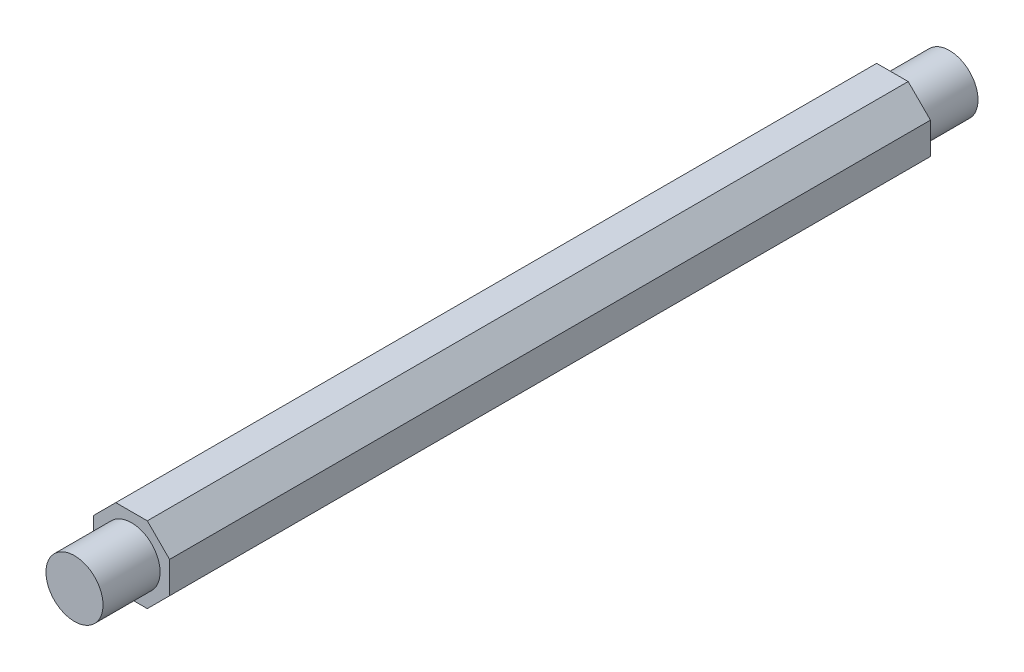
ISO-10303-21;
HEADER;
FILE_DESCRIPTION(('STEP AP214'),'2;1');
FILE_NAME('part.step','',(''),(''),'','','');
FILE_SCHEMA(('AUTOMOTIVE_DESIGN { 1 0 10303 214 1 1 1 1 }'));
ENDSEC;
DATA;
#1=APPLICATION_CONTEXT('core data for automotive mechanical design processes');
#2=APPLICATION_PROTOCOL_DEFINITION('international standard','automotive_design',2000,#1);
#3=PRODUCT_CONTEXT('',#1,'mechanical');
#4=PRODUCT('Part','Part','',(#3));
#5=PRODUCT_RELATED_PRODUCT_CATEGORY('part','',(#4));
#6=PRODUCT_DEFINITION_FORMATION('','',#4);
#7=PRODUCT_DEFINITION_CONTEXT('part definition',#1,'design');
#8=PRODUCT_DEFINITION('design','',#6,#7);
#9=PRODUCT_DEFINITION_SHAPE('','',#8);
#10=(LENGTH_UNIT() NAMED_UNIT(*) SI_UNIT(.MILLI.,.METRE.));
#11=(NAMED_UNIT(*) PLANE_ANGLE_UNIT() SI_UNIT($,.RADIAN.));
#12=(NAMED_UNIT(*) SI_UNIT($,.STERADIAN.) SOLID_ANGLE_UNIT());
#13=UNCERTAINTY_MEASURE_WITH_UNIT(LENGTH_MEASURE(1.E-05),#10,'distance_accuracy_value','');
#14=(GEOMETRIC_REPRESENTATION_CONTEXT(3) GLOBAL_UNCERTAINTY_ASSIGNED_CONTEXT((#13)) GLOBAL_UNIT_ASSIGNED_CONTEXT((#10,
#11,#12)) REPRESENTATION_CONTEXT('',''));
#15=CARTESIAN_POINT('',(0.,0.,0.));
#16=DIRECTION('',(0.,0.,1.));
#17=DIRECTION('',(1.,0.,0.));
#18=AXIS2_PLACEMENT_3D('',#15,#16,#17);
#19=CARTESIAN_POINT('',(-2.,-0.828427124746184,3.));
#20=DIRECTION('',(-0.707106781186551,-0.707106781186544,0.));
#21=DIRECTION('',(0.707106781186544,-0.707106781186551,0.));
#22=AXIS2_PLACEMENT_3D('',#19,#20,#21);
#23=PLANE('',#22);
#24=DIRECTION('',(0.,0.,1.));
#25=VECTOR('',#24,1.);
#26=CARTESIAN_POINT('',(-0.828427124746196,-2.,3.));
#27=LINE('',#26,#25);
#28=CARTESIAN_POINT('',(-0.828427124746196,-2.,3.));
#29=VERTEX_POINT('',#28);
#30=CARTESIAN_POINT('',(-0.828427124746196,-2.,43.));
#31=VERTEX_POINT('',#30);
#32=EDGE_CURVE('E125',#29,#31,#27,.T.);
#33=ORIENTED_EDGE('',*,*,#32,.T.);
#34=DIRECTION('',(-0.707106781186544,0.707106781186551,0.));
#35=VECTOR('',#34,1.);
#36=CARTESIAN_POINT('',(-2.,-0.828427124746184,43.));
#37=LINE('',#36,#35);
#38=CARTESIAN_POINT('',(-2.,-0.828427124746184,43.));
#39=VERTEX_POINT('',#38);
#40=EDGE_CURVE('E53',#31,#39,#37,.T.);
#41=ORIENTED_EDGE('',*,*,#40,.T.);
#42=DIRECTION('',(0.,0.,1.));
#43=VECTOR('',#42,1.);
#44=CARTESIAN_POINT('',(-2.,-0.828427124746184,3.));
#45=LINE('',#44,#43);
#46=CARTESIAN_POINT('',(-2.,-0.828427124746184,3.));
#47=VERTEX_POINT('',#46);
#48=EDGE_CURVE('E58',#47,#39,#45,.T.);
#49=ORIENTED_EDGE('',*,*,#48,.F.);
#50=DIRECTION('',(0.707106781186544,-0.707106781186551,0.));
#51=VECTOR('',#50,1.);
#52=CARTESIAN_POINT('',(-2.,-0.828427124746184,3.));
#53=LINE('',#52,#51);
#54=EDGE_CURVE('E178',#47,#29,#53,.T.);
#55=ORIENTED_EDGE('',*,*,#54,.T.);
#56=EDGE_LOOP('',(#33,#41,#49,#55));
#57=FACE_BOUND('',#56,.T.);
#58=ADVANCED_FACE('F39',(#57),#23,.T.);
#59=CARTESIAN_POINT('',(-2.,0.828427124746196,3.));
#60=DIRECTION('',(-1.,0.,0.));
#61=DIRECTION('',(0.,-1.,0.));
#62=AXIS2_PLACEMENT_3D('',#59,#60,#61);
#63=PLANE('',#62);
#64=ORIENTED_EDGE('',*,*,#48,.T.);
#65=DIRECTION('',(0.,1.,0.));
#66=VECTOR('',#65,1.);
#67=CARTESIAN_POINT('',(-2.,0.828427124746196,43.));
#68=LINE('',#67,#66);
#69=CARTESIAN_POINT('',(-2.,0.828427124746196,43.));
#70=VERTEX_POINT('',#69);
#71=EDGE_CURVE('E181',#39,#70,#68,.T.);
#72=ORIENTED_EDGE('',*,*,#71,.T.);
#73=DIRECTION('',(0.,0.,1.));
#74=VECTOR('',#73,1.);
#75=CARTESIAN_POINT('',(-2.,0.828427124746196,3.));
#76=LINE('',#75,#74);
#77=CARTESIAN_POINT('',(-2.,0.828427124746196,3.));
#78=VERTEX_POINT('',#77);
#79=EDGE_CURVE('E137',#78,#70,#76,.T.);
#80=ORIENTED_EDGE('',*,*,#79,.F.);
#81=DIRECTION('',(0.,-1.,0.));
#82=VECTOR('',#81,1.);
#83=CARTESIAN_POINT('',(-2.,0.828427124746196,3.));
#84=LINE('',#83,#82);
#85=EDGE_CURVE('E130',#78,#47,#84,.T.);
#86=ORIENTED_EDGE('',*,*,#85,.T.);
#87=EDGE_LOOP('',(#64,#72,#80,#86));
#88=FACE_BOUND('',#87,.T.);
#89=ADVANCED_FACE('F176',(#88),#63,.T.);
#90=CARTESIAN_POINT('',(-2.,0.828427124746196,3.));
#91=DIRECTION('',(-0.707106781186544,0.707106781186551,0.));
#92=DIRECTION('',(-0.707106781186551,-0.707106781186544,0.));
#93=AXIS2_PLACEMENT_3D('',#90,#91,#92);
#94=PLANE('',#93);
#95=ORIENTED_EDGE('',*,*,#79,.T.);
#96=DIRECTION('',(0.707106781186551,0.707106781186544,0.));
#97=VECTOR('',#96,1.);
#98=CARTESIAN_POINT('',(-2.,0.828427124746196,43.));
#99=LINE('',#98,#97);
#100=CARTESIAN_POINT('',(-0.828427124746184,2.,43.));
#101=VERTEX_POINT('',#100);
#102=EDGE_CURVE('E190',#70,#101,#99,.T.);
#103=ORIENTED_EDGE('',*,*,#102,.T.);
#104=DIRECTION('',(0.,0.,1.));
#105=VECTOR('',#104,1.);
#106=CARTESIAN_POINT('',(-0.828427124746184,2.,3.));
#107=LINE('',#106,#105);
#108=CARTESIAN_POINT('',(-0.828427124746184,2.,3.));
#109=VERTEX_POINT('',#108);
#110=EDGE_CURVE('E142',#109,#101,#107,.T.);
#111=ORIENTED_EDGE('',*,*,#110,.F.);
#112=DIRECTION('',(-0.707106781186551,-0.707106781186544,0.));
#113=VECTOR('',#112,1.);
#114=CARTESIAN_POINT('',(-2.,0.828427124746196,3.));
#115=LINE('',#114,#113);
#116=EDGE_CURVE('E172',#109,#78,#115,.T.);
#117=ORIENTED_EDGE('',*,*,#116,.T.);
#118=EDGE_LOOP('',(#95,#103,#111,#117));
#119=FACE_BOUND('',#118,.T.);
#120=ADVANCED_FACE('F219',(#119),#94,.T.);
#121=CARTESIAN_POINT('',(-0.828427124746184,2.,3.));
#122=DIRECTION('',(0.,1.,0.));
#123=DIRECTION('',(0.,0.,1.));
#124=AXIS2_PLACEMENT_3D('',#121,#122,#123);
#125=PLANE('',#124);
#126=ORIENTED_EDGE('',*,*,#110,.T.);
#127=DIRECTION('',(1.,0.,0.));
#128=VECTOR('',#127,1.);
#129=CARTESIAN_POINT('',(-0.828427124746184,2.,43.));
#130=LINE('',#129,#128);
#131=CARTESIAN_POINT('',(0.828427124746196,2.,43.));
#132=VERTEX_POINT('',#131);
#133=EDGE_CURVE('E188',#101,#132,#130,.T.);
#134=ORIENTED_EDGE('',*,*,#133,.T.);
#135=DIRECTION('',(0.,0.,1.));
#136=VECTOR('',#135,1.);
#137=CARTESIAN_POINT('',(0.828427124746196,2.,3.));
#138=LINE('',#137,#136);
#139=CARTESIAN_POINT('',(0.828427124746196,2.,3.));
#140=VERTEX_POINT('',#139);
#141=EDGE_CURVE('E149',#140,#132,#138,.T.);
#142=ORIENTED_EDGE('',*,*,#141,.F.);
#143=DIRECTION('',(-1.,0.,0.));
#144=VECTOR('',#143,1.);
#145=CARTESIAN_POINT('',(-0.828427124746184,2.,3.));
#146=LINE('',#145,#144);
#147=EDGE_CURVE('E166',#140,#109,#146,.T.);
#148=ORIENTED_EDGE('',*,*,#147,.T.);
#149=EDGE_LOOP('',(#126,#134,#142,#148));
#150=FACE_BOUND('',#149,.T.);
#151=ADVANCED_FACE('F247',(#150),#125,.T.);
#152=CARTESIAN_POINT('',(0.828427124746196,2.,3.));
#153=DIRECTION('',(0.707106781186551,0.707106781186544,0.));
#154=DIRECTION('',(-0.707106781186544,0.707106781186551,0.));
#155=AXIS2_PLACEMENT_3D('',#152,#153,#154);
#156=PLANE('',#155);
#157=ORIENTED_EDGE('',*,*,#141,.T.);
#158=DIRECTION('',(0.707106781186544,-0.707106781186551,0.));
#159=VECTOR('',#158,1.);
#160=CARTESIAN_POINT('',(0.828427124746196,2.,43.));
#161=LINE('',#160,#159);
#162=CARTESIAN_POINT('',(2.,0.828427124746184,43.));
#163=VERTEX_POINT('',#162);
#164=EDGE_CURVE('E162',#132,#163,#161,.T.);
#165=ORIENTED_EDGE('',*,*,#164,.T.);
#166=DIRECTION('',(0.,0.,1.));
#167=VECTOR('',#166,1.);
#168=CARTESIAN_POINT('',(2.,0.828427124746184,3.));
#169=LINE('',#168,#167);
#170=CARTESIAN_POINT('',(2.,0.828427124746184,3.));
#171=VERTEX_POINT('',#170);
#172=EDGE_CURVE('E123',#171,#163,#169,.T.);
#173=ORIENTED_EDGE('',*,*,#172,.F.);
#174=DIRECTION('',(-0.707106781186544,0.707106781186551,0.));
#175=VECTOR('',#174,1.);
#176=CARTESIAN_POINT('',(0.828427124746196,2.,3.));
#177=LINE('',#176,#175);
#178=EDGE_CURVE('E165',#171,#140,#177,.T.);
#179=ORIENTED_EDGE('',*,*,#178,.T.);
#180=EDGE_LOOP('',(#157,#165,#173,#179));
#181=FACE_BOUND('',#180,.T.);
#182=ADVANCED_FACE('F161',(#181),#156,.T.);
#183=CARTESIAN_POINT('',(2.,0.828427124746184,3.));
#184=DIRECTION('',(1.,0.,0.));
#185=DIRECTION('',(0.,1.,0.));
#186=AXIS2_PLACEMENT_3D('',#183,#184,#185);
#187=PLANE('',#186);
#188=ORIENTED_EDGE('',*,*,#172,.T.);
#189=DIRECTION('',(0.,-1.,0.));
#190=VECTOR('',#189,1.);
#191=CARTESIAN_POINT('',(2.,0.828427124746184,43.));
#192=LINE('',#191,#190);
#193=CARTESIAN_POINT('',(2.,-0.828427124746196,43.));
#194=VERTEX_POINT('',#193);
#195=EDGE_CURVE('E117',#163,#194,#192,.T.);
#196=ORIENTED_EDGE('',*,*,#195,.T.);
#197=DIRECTION('',(0.,0.,1.));
#198=VECTOR('',#197,1.);
#199=CARTESIAN_POINT('',(2.,-0.828427124746196,3.));
#200=LINE('',#199,#198);
#201=CARTESIAN_POINT('',(2.,-0.828427124746196,3.));
#202=VERTEX_POINT('',#201);
#203=EDGE_CURVE('E113',#202,#194,#200,.T.);
#204=ORIENTED_EDGE('',*,*,#203,.F.);
#205=DIRECTION('',(0.,1.,0.));
#206=VECTOR('',#205,1.);
#207=CARTESIAN_POINT('',(2.,0.828427124746184,3.));
#208=LINE('',#207,#206);
#209=EDGE_CURVE('E156',#202,#171,#208,.T.);
#210=ORIENTED_EDGE('',*,*,#209,.T.);
#211=EDGE_LOOP('',(#188,#196,#204,#210));
#212=FACE_BOUND('',#211,.T.);
#213=ADVANCED_FACE('F152',(#212),#187,.T.);
#214=CARTESIAN_POINT('',(2.,-0.828427124746196,3.));
#215=DIRECTION('',(0.707106781186544,-0.707106781186551,0.));
#216=DIRECTION('',(0.707106781186551,0.707106781186544,0.));
#217=AXIS2_PLACEMENT_3D('',#214,#215,#216);
#218=PLANE('',#217);
#219=ORIENTED_EDGE('',*,*,#203,.T.);
#220=DIRECTION('',(-0.707106781186551,-0.707106781186544,0.));
#221=VECTOR('',#220,1.);
#222=CARTESIAN_POINT('',(2.,-0.828427124746196,43.));
#223=LINE('',#222,#221);
#224=CARTESIAN_POINT('',(0.828427124746184,-2.,43.));
#225=VERTEX_POINT('',#224);
#226=EDGE_CURVE('E102',#194,#225,#223,.T.);
#227=ORIENTED_EDGE('',*,*,#226,.T.);
#228=DIRECTION('',(0.,0.,1.));
#229=VECTOR('',#228,1.);
#230=CARTESIAN_POINT('',(0.828427124746184,-2.,3.));
#231=LINE('',#230,#229);
#232=CARTESIAN_POINT('',(0.828427124746184,-2.,3.));
#233=VERTEX_POINT('',#232);
#234=EDGE_CURVE('E114',#233,#225,#231,.T.);
#235=ORIENTED_EDGE('',*,*,#234,.F.);
#236=DIRECTION('',(0.707106781186551,0.707106781186544,0.));
#237=VECTOR('',#236,1.);
#238=CARTESIAN_POINT('',(2.,-0.828427124746196,3.));
#239=LINE('',#238,#237);
#240=EDGE_CURVE('E174',#233,#202,#239,.T.);
#241=ORIENTED_EDGE('',*,*,#240,.T.);
#242=EDGE_LOOP('',(#219,#227,#235,#241));
#243=FACE_BOUND('',#242,.T.);
#244=ADVANCED_FACE('F112',(#243),#218,.T.);
#245=CARTESIAN_POINT('',(-0.828427124746196,-2.,3.));
#246=DIRECTION('',(0.,-1.,0.));
#247=DIRECTION('',(0.,0.,-1.));
#248=AXIS2_PLACEMENT_3D('',#245,#246,#247);
#249=PLANE('',#248);
#250=ORIENTED_EDGE('',*,*,#234,.T.);
#251=DIRECTION('',(-1.,0.,0.));
#252=VECTOR('',#251,1.);
#253=CARTESIAN_POINT('',(-0.828427124746196,-2.,43.));
#254=LINE('',#253,#252);
#255=EDGE_CURVE('E11',#225,#31,#254,.T.);
#256=ORIENTED_EDGE('',*,*,#255,.T.);
#257=ORIENTED_EDGE('',*,*,#32,.F.);
#258=DIRECTION('',(1.,0.,0.));
#259=VECTOR('',#258,1.);
#260=CARTESIAN_POINT('',(-0.828427124746196,-2.,3.));
#261=LINE('',#260,#259);
#262=EDGE_CURVE('E124',#29,#233,#261,.T.);
#263=ORIENTED_EDGE('',*,*,#262,.T.);
#264=EDGE_LOOP('',(#250,#256,#257,#263));
#265=FACE_BOUND('',#264,.T.);
#266=ADVANCED_FACE('F118',(#265),#249,.T.);
#267=CARTESIAN_POINT('',(0.,0.,46.));
#268=DIRECTION('',(0.,0.,-1.));
#269=DIRECTION('',(-1.,0.,0.));
#270=AXIS2_PLACEMENT_3D('',#267,#268,#269);
#271=CYLINDRICAL_SURFACE('',#270,1.5);
#272=CARTESIAN_POINT('',(0.,0.,3.));
#273=DIRECTION('',(0.,0.,-1.));
#274=DIRECTION('',(-1.,0.,0.));
#275=AXIS2_PLACEMENT_3D('',#272,#273,#274);
#276=CIRCLE('',#275,1.5);
#277=CARTESIAN_POINT('',(-1.5,0.,3.));
#278=VERTEX_POINT('',#277);
#279=EDGE_CURVE('E135',#278,#278,#276,.T.);
#280=ORIENTED_EDGE('',*,*,#279,.T.);
#281=EDGE_LOOP('',(#280));
#282=FACE_BOUND('',#281,.T.);
#283=CARTESIAN_POINT('',(0.,0.,0.));
#284=DIRECTION('',(0.,0.,1.));
#285=DIRECTION('',(1.,0.,0.));
#286=AXIS2_PLACEMENT_3D('',#283,#284,#285);
#287=CIRCLE('',#286,1.5);
#288=CARTESIAN_POINT('',(1.5,0.,0.));
#289=VERTEX_POINT('',#288);
#290=EDGE_CURVE('E50',#289,#289,#287,.T.);
#291=ORIENTED_EDGE('',*,*,#290,.T.);
#292=EDGE_LOOP('',(#291));
#293=FACE_BOUND('',#292,.T.);
#294=ADVANCED_FACE('F41',(#282,#293),#271,.T.);
#295=CARTESIAN_POINT('',(0.,0.,0.));
#296=DIRECTION('',(0.,0.,1.));
#297=DIRECTION('',(1.,0.,0.));
#298=AXIS2_PLACEMENT_3D('',#295,#296,#297);
#299=PLANE('',#298);
#300=ORIENTED_EDGE('',*,*,#290,.F.);
#301=EDGE_LOOP('',(#300));
#302=FACE_BOUND('',#301,.T.);
#303=ADVANCED_FACE('F215',(#302),#299,.F.);
#304=CARTESIAN_POINT('',(0.,0.,3.));
#305=DIRECTION('',(0.,0.,-1.));
#306=DIRECTION('',(-1.,0.,0.));
#307=AXIS2_PLACEMENT_3D('',#304,#305,#306);
#308=PLANE('',#307);
#309=ORIENTED_EDGE('',*,*,#279,.F.);
#310=EDGE_LOOP('',(#309));
#311=FACE_BOUND('',#310,.T.);
#312=ORIENTED_EDGE('',*,*,#54,.F.);
#313=ORIENTED_EDGE('',*,*,#85,.F.);
#314=ORIENTED_EDGE('',*,*,#116,.F.);
#315=ORIENTED_EDGE('',*,*,#147,.F.);
#316=ORIENTED_EDGE('',*,*,#178,.F.);
#317=ORIENTED_EDGE('',*,*,#209,.F.);
#318=ORIENTED_EDGE('',*,*,#240,.F.);
#319=ORIENTED_EDGE('',*,*,#262,.F.);
#320=EDGE_LOOP('',(#312,#313,#314,#315,#316,#317,#318,#319));
#321=FACE_BOUND('',#320,.T.);
#322=ADVANCED_FACE('F167',(#311,#321),#308,.T.);
#323=CARTESIAN_POINT('',(0.,0.,43.));
#324=DIRECTION('',(0.,0.,1.));
#325=DIRECTION('',(1.,0.,0.));
#326=AXIS2_PLACEMENT_3D('',#323,#324,#325);
#327=PLANE('',#326);
#328=ORIENTED_EDGE('',*,*,#255,.F.);
#329=ORIENTED_EDGE('',*,*,#226,.F.);
#330=ORIENTED_EDGE('',*,*,#195,.F.);
#331=ORIENTED_EDGE('',*,*,#164,.F.);
#332=ORIENTED_EDGE('',*,*,#133,.F.);
#333=ORIENTED_EDGE('',*,*,#102,.F.);
#334=ORIENTED_EDGE('',*,*,#71,.F.);
#335=ORIENTED_EDGE('',*,*,#40,.F.);
#336=EDGE_LOOP('',(#328,#329,#330,#331,#332,#333,#334,#335));
#337=FACE_BOUND('',#336,.T.);
#338=CARTESIAN_POINT('',(0.,0.,43.));
#339=DIRECTION('',(0.,0.,1.));
#340=DIRECTION('',(1.,0.,0.));
#341=AXIS2_PLACEMENT_3D('',#338,#339,#340);
#342=CIRCLE('',#341,1.5);
#343=CARTESIAN_POINT('',(1.5,0.,43.));
#344=VERTEX_POINT('',#343);
#345=EDGE_CURVE('E120',#344,#344,#342,.T.);
#346=ORIENTED_EDGE('',*,*,#345,.F.);
#347=EDGE_LOOP('',(#346));
#348=FACE_BOUND('',#347,.T.);
#349=ADVANCED_FACE('F105',(#337,#348),#327,.T.);
#350=CARTESIAN_POINT('',(0.,0.,43.));
#351=DIRECTION('',(0.,0.,1.));
#352=DIRECTION('',(1.,0.,0.));
#353=AXIS2_PLACEMENT_3D('',#350,#351,#352);
#354=CYLINDRICAL_SURFACE('',#353,1.5);
#355=ORIENTED_EDGE('',*,*,#345,.T.);
#356=EDGE_LOOP('',(#355));
#357=FACE_BOUND('',#356,.T.);
#358=CARTESIAN_POINT('',(0.,0.,46.));
#359=DIRECTION('',(0.,0.,1.));
#360=DIRECTION('',(1.,0.,0.));
#361=AXIS2_PLACEMENT_3D('',#358,#359,#360);
#362=CIRCLE('',#361,1.5);
#363=CARTESIAN_POINT('',(1.5,0.,46.));
#364=VERTEX_POINT('',#363);
#365=EDGE_CURVE('E193',#364,#364,#362,.T.);
#366=ORIENTED_EDGE('',*,*,#365,.F.);
#367=EDGE_LOOP('',(#366));
#368=FACE_BOUND('',#367,.T.);
#369=ADVANCED_FACE('F203',(#357,#368),#354,.T.);
#370=CARTESIAN_POINT('',(0.,0.,46.));
#371=DIRECTION('',(0.,0.,1.));
#372=DIRECTION('',(1.,0.,0.));
#373=AXIS2_PLACEMENT_3D('',#370,#371,#372);
#374=PLANE('',#373);
#375=ORIENTED_EDGE('',*,*,#365,.T.);
#376=EDGE_LOOP('',(#375));
#377=FACE_BOUND('',#376,.T.);
#378=ADVANCED_FACE('F207',(#377),#374,.T.);
#379=CLOSED_SHELL('',(#58,#89,#120,#151,#182,#213,#244,#266,#294,#303,#322,#349,#369,#378));
#380=MANIFOLD_SOLID_BREP('B2',#379);
#381=ADVANCED_BREP_SHAPE_REPRESENTATION('',(#18,#380),#14);
#382=SHAPE_DEFINITION_REPRESENTATION(#9,#381);
ENDSEC;
END-ISO-10303-21;
